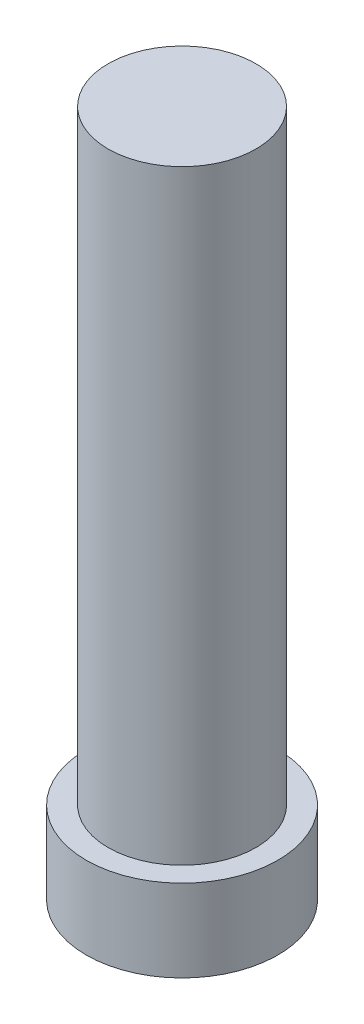
ISO-10303-21;
HEADER;
FILE_DESCRIPTION(('STEP AP214'),'2;1');
FILE_NAME('part.step','',(''),(''),'','','');
FILE_SCHEMA(('AUTOMOTIVE_DESIGN { 1 0 10303 214 1 1 1 1 }'));
ENDSEC;
DATA;
#1=APPLICATION_CONTEXT('core data for automotive mechanical design processes');
#2=APPLICATION_PROTOCOL_DEFINITION('international standard','automotive_design',2000,#1);
#3=PRODUCT_CONTEXT('',#1,'mechanical');
#4=PRODUCT('Part','Part','',(#3));
#5=PRODUCT_RELATED_PRODUCT_CATEGORY('part','',(#4));
#6=PRODUCT_DEFINITION_FORMATION('','',#4);
#7=PRODUCT_DEFINITION_CONTEXT('part definition',#1,'design');
#8=PRODUCT_DEFINITION('design','',#6,#7);
#9=PRODUCT_DEFINITION_SHAPE('','',#8);
#10=(LENGTH_UNIT() NAMED_UNIT(*) SI_UNIT(.MILLI.,.METRE.));
#11=(NAMED_UNIT(*) PLANE_ANGLE_UNIT() SI_UNIT($,.RADIAN.));
#12=(NAMED_UNIT(*) SI_UNIT($,.STERADIAN.) SOLID_ANGLE_UNIT());
#13=UNCERTAINTY_MEASURE_WITH_UNIT(LENGTH_MEASURE(1.E-05),#10,'distance_accuracy_value','');
#14=(GEOMETRIC_REPRESENTATION_CONTEXT(3) GLOBAL_UNCERTAINTY_ASSIGNED_CONTEXT((#13)) GLOBAL_UNIT_ASSIGNED_CONTEXT((#10,
#11,#12)) REPRESENTATION_CONTEXT('',''));
#15=CARTESIAN_POINT('',(0.,0.,0.));
#16=DIRECTION('',(0.,0.,1.));
#17=DIRECTION('',(1.,0.,0.));
#18=AXIS2_PLACEMENT_3D('',#15,#16,#17);
#19=CARTESIAN_POINT('',(0.,3.,0.));
#20=DIRECTION('',(0.,-1.,0.));
#21=DIRECTION('',(0.,0.,-1.));
#22=AXIS2_PLACEMENT_3D('',#19,#20,#21);
#23=CYLINDRICAL_SURFACE('',#22,3.5);
#24=CARTESIAN_POINT('',(0.,3.,0.));
#25=DIRECTION('',(0.,1.,0.));
#26=DIRECTION('',(0.,0.,1.));
#27=AXIS2_PLACEMENT_3D('',#24,#25,#26);
#28=CIRCLE('',#27,3.5);
#29=CARTESIAN_POINT('',(0.,3.,3.5));
#30=VERTEX_POINT('',#29);
#31=EDGE_CURVE('E45',#30,#30,#28,.T.);
#32=ORIENTED_EDGE('',*,*,#31,.F.);
#33=EDGE_LOOP('',(#32));
#34=FACE_BOUND('',#33,.T.);
#35=CARTESIAN_POINT('',(0.,0.,0.));
#36=DIRECTION('',(0.,1.,0.));
#37=DIRECTION('',(0.,0.,1.));
#38=AXIS2_PLACEMENT_3D('',#35,#36,#37);
#39=CIRCLE('',#38,3.5);
#40=CARTESIAN_POINT('',(0.,0.,3.5));
#41=VERTEX_POINT('',#40);
#42=EDGE_CURVE('E40',#41,#41,#39,.T.);
#43=ORIENTED_EDGE('',*,*,#42,.T.);
#44=EDGE_LOOP('',(#43));
#45=FACE_BOUND('',#44,.T.);
#46=ADVANCED_FACE('F37',(#34,#45),#23,.T.);
#47=CARTESIAN_POINT('',(0.,3.,0.));
#48=DIRECTION('',(0.,1.,0.));
#49=DIRECTION('',(0.,0.,1.));
#50=AXIS2_PLACEMENT_3D('',#47,#48,#49);
#51=PLANE('',#50);
#52=CARTESIAN_POINT('',(0.,3.,0.));
#53=DIRECTION('',(0.,1.,0.));
#54=DIRECTION('',(0.,0.,1.));
#55=AXIS2_PLACEMENT_3D('',#52,#53,#54);
#56=CIRCLE('',#55,2.7);
#57=CARTESIAN_POINT('',(0.,3.,2.7));
#58=VERTEX_POINT('',#57);
#59=EDGE_CURVE('E10',#58,#58,#56,.T.);
#60=ORIENTED_EDGE('',*,*,#59,.F.);
#61=EDGE_LOOP('',(#60));
#62=FACE_BOUND('',#61,.T.);
#63=ORIENTED_EDGE('',*,*,#31,.T.);
#64=EDGE_LOOP('',(#63));
#65=FACE_BOUND('',#64,.T.);
#66=ADVANCED_FACE('F65',(#62,#65),#51,.T.);
#67=CARTESIAN_POINT('',(0.,0.,0.));
#68=DIRECTION('',(0.,1.,0.));
#69=DIRECTION('',(0.,0.,1.));
#70=AXIS2_PLACEMENT_3D('',#67,#68,#69);
#71=PLANE('',#70);
#72=ORIENTED_EDGE('',*,*,#42,.F.);
#73=EDGE_LOOP('',(#72));
#74=FACE_BOUND('',#73,.T.);
#75=ADVANCED_FACE('F62',(#74),#71,.F.);
#76=CARTESIAN_POINT('',(0.,25.1,0.));
#77=DIRECTION('',(0.,-1.,0.));
#78=DIRECTION('',(0.,0.,-1.));
#79=AXIS2_PLACEMENT_3D('',#76,#77,#78);
#80=CYLINDRICAL_SURFACE('',#79,2.7);
#81=CARTESIAN_POINT('',(0.,25.1,0.));
#82=DIRECTION('',(0.,1.,0.));
#83=DIRECTION('',(0.,0.,1.));
#84=AXIS2_PLACEMENT_3D('',#81,#82,#83);
#85=CIRCLE('',#84,2.7);
#86=CARTESIAN_POINT('',(0.,25.1,2.7));
#87=VERTEX_POINT('',#86);
#88=EDGE_CURVE('E52',#87,#87,#85,.T.);
#89=ORIENTED_EDGE('',*,*,#88,.F.);
#90=EDGE_LOOP('',(#89));
#91=FACE_BOUND('',#90,.T.);
#92=ORIENTED_EDGE('',*,*,#59,.T.);
#93=EDGE_LOOP('',(#92));
#94=FACE_BOUND('',#93,.T.);
#95=ADVANCED_FACE('F64',(#91,#94),#80,.T.);
#96=CARTESIAN_POINT('',(0.,25.1,0.));
#97=DIRECTION('',(0.,1.,0.));
#98=DIRECTION('',(0.,0.,1.));
#99=AXIS2_PLACEMENT_3D('',#96,#97,#98);
#100=PLANE('',#99);
#101=ORIENTED_EDGE('',*,*,#88,.T.);
#102=EDGE_LOOP('',(#101));
#103=FACE_BOUND('',#102,.T.);
#104=ADVANCED_FACE('F70',(#103),#100,.T.);
#105=CLOSED_SHELL('',(#46,#66,#75,#95,#104));
#106=MANIFOLD_SOLID_BREP('B2',#105);
#107=ADVANCED_BREP_SHAPE_REPRESENTATION('',(#18,#106),#14);
#108=SHAPE_DEFINITION_REPRESENTATION(#9,#107);
ENDSEC;
END-ISO-10303-21;
